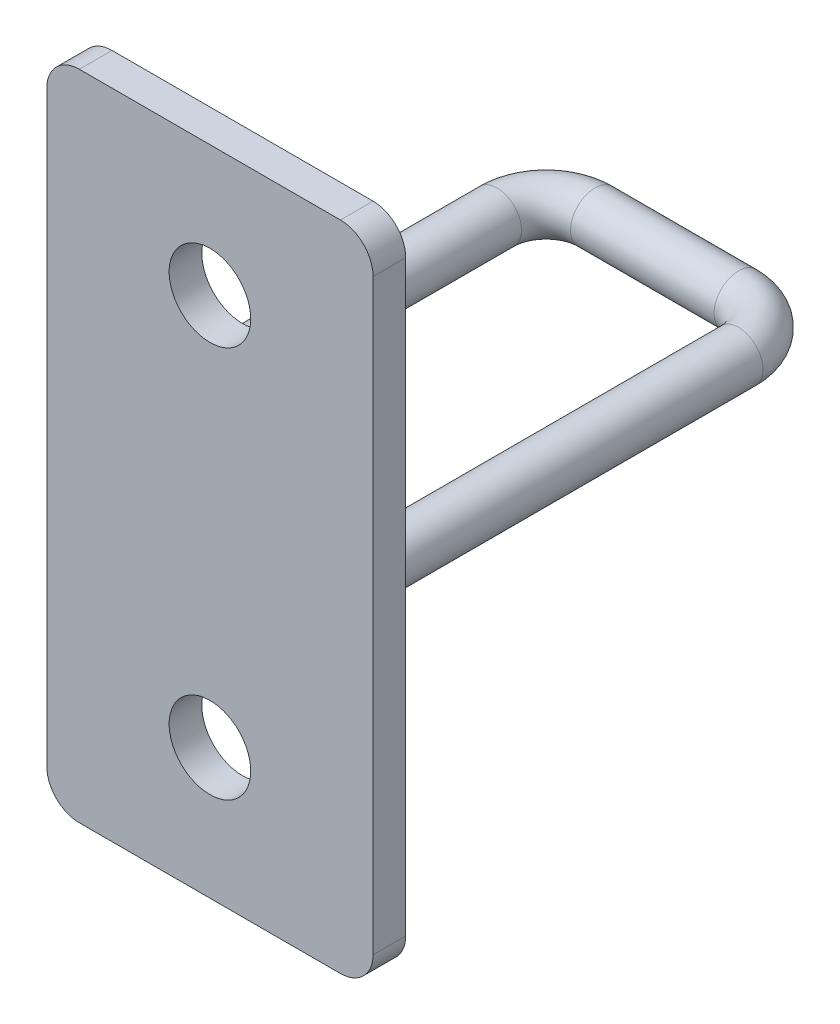
ISO-10303-21;
HEADER;
FILE_DESCRIPTION(('STEP AP214'),'2;1');
FILE_NAME('part.step','',(''),(''),'','','');
FILE_SCHEMA(('AUTOMOTIVE_DESIGN { 1 0 10303 214 1 1 1 1 }'));
ENDSEC;
DATA;
#1=APPLICATION_CONTEXT('core data for automotive mechanical design processes');
#2=APPLICATION_PROTOCOL_DEFINITION('international standard','automotive_design',2000,#1);
#3=PRODUCT_CONTEXT('',#1,'mechanical');
#4=PRODUCT('Part','Part','',(#3));
#5=PRODUCT_RELATED_PRODUCT_CATEGORY('part','',(#4));
#6=PRODUCT_DEFINITION_FORMATION('','',#4);
#7=PRODUCT_DEFINITION_CONTEXT('part definition',#1,'design');
#8=PRODUCT_DEFINITION('design','',#6,#7);
#9=PRODUCT_DEFINITION_SHAPE('','',#8);
#10=(LENGTH_UNIT() NAMED_UNIT(*) SI_UNIT(.MILLI.,.METRE.));
#11=(NAMED_UNIT(*) PLANE_ANGLE_UNIT() SI_UNIT($,.RADIAN.));
#12=(NAMED_UNIT(*) SI_UNIT($,.STERADIAN.) SOLID_ANGLE_UNIT());
#13=UNCERTAINTY_MEASURE_WITH_UNIT(LENGTH_MEASURE(1.E-05),#10,'distance_accuracy_value','');
#14=(GEOMETRIC_REPRESENTATION_CONTEXT(3) GLOBAL_UNCERTAINTY_ASSIGNED_CONTEXT((#13)) GLOBAL_UNIT_ASSIGNED_CONTEXT((#10,
#11,#12)) REPRESENTATION_CONTEXT('',''));
#15=CARTESIAN_POINT('',(0.,0.,0.));
#16=DIRECTION('',(0.,0.,1.));
#17=DIRECTION('',(1.,0.,0.));
#18=AXIS2_PLACEMENT_3D('',#15,#16,#17);
#19=CARTESIAN_POINT('',(0.,0.,0.));
#20=DIRECTION('',(0.,0.,1.));
#21=DIRECTION('',(1.,0.,0.));
#22=AXIS2_PLACEMENT_3D('',#19,#20,#21);
#23=PLANE('',#22);
#24=CARTESIAN_POINT('',(5.,-16.,0.));
#25=DIRECTION('',(0.,0.,1.));
#26=DIRECTION('',(1.,0.,0.));
#27=AXIS2_PLACEMENT_3D('',#24,#25,#26);
#28=CIRCLE('',#27,1.25);
#29=CARTESIAN_POINT('',(6.25,-16.,0.));
#30=VERTEX_POINT('',#29);
#31=EDGE_CURVE('E197',#30,#30,#28,.T.);
#32=ORIENTED_EDGE('',*,*,#31,.T.);
#33=EDGE_LOOP('',(#32));
#34=FACE_BOUND('',#33,.T.);
#35=CARTESIAN_POINT('',(5.,-4.,0.));
#36=DIRECTION('',(0.,0.,1.));
#37=DIRECTION('',(1.,0.,0.));
#38=AXIS2_PLACEMENT_3D('',#35,#36,#37);
#39=CIRCLE('',#38,1.25);
#40=CARTESIAN_POINT('',(6.25,-4.,0.));
#41=VERTEX_POINT('',#40);
#42=EDGE_CURVE('E186',#41,#41,#39,.T.);
#43=ORIENTED_EDGE('',*,*,#42,.T.);
#44=EDGE_LOOP('',(#43));
#45=FACE_BOUND('',#44,.T.);
#46=DIRECTION('',(0.,1.,0.));
#47=VECTOR('',#46,1.);
#48=CARTESIAN_POINT('',(10.,0.,0.));
#49=LINE('',#48,#47);
#50=CARTESIAN_POINT('',(10.,-19.,0.));
#51=VERTEX_POINT('',#50);
#52=CARTESIAN_POINT('',(10.,-1.,0.));
#53=VERTEX_POINT('',#52);
#54=EDGE_CURVE('E127',#51,#53,#49,.T.);
#55=ORIENTED_EDGE('',*,*,#54,.F.);
#56=CARTESIAN_POINT('',(9.,-19.,0.));
#57=DIRECTION('',(0.,0.,1.));
#58=DIRECTION('',(1.,0.,0.));
#59=AXIS2_PLACEMENT_3D('',#56,#57,#58);
#60=CIRCLE('',#59,1.);
#61=CARTESIAN_POINT('',(9.,-20.,0.));
#62=VERTEX_POINT('',#61);
#63=EDGE_CURVE('E110',#51,#62,#60,.F.);
#64=ORIENTED_EDGE('',*,*,#63,.T.);
#65=DIRECTION('',(1.,0.,0.));
#66=VECTOR('',#65,1.);
#67=CARTESIAN_POINT('',(0.,-20.,0.));
#68=LINE('',#67,#66);
#69=CARTESIAN_POINT('',(1.,-20.,0.));
#70=VERTEX_POINT('',#69);
#71=EDGE_CURVE('E136',#70,#62,#68,.T.);
#72=ORIENTED_EDGE('',*,*,#71,.F.);
#73=CARTESIAN_POINT('',(1.,-19.,0.));
#74=DIRECTION('',(0.,0.,1.));
#75=DIRECTION('',(1.,0.,0.));
#76=AXIS2_PLACEMENT_3D('',#73,#74,#75);
#77=CIRCLE('',#76,1.);
#78=CARTESIAN_POINT('',(0.,-19.,0.));
#79=VERTEX_POINT('',#78);
#80=EDGE_CURVE('E121',#70,#79,#77,.F.);
#81=ORIENTED_EDGE('',*,*,#80,.T.);
#82=DIRECTION('',(0.,-1.,0.));
#83=VECTOR('',#82,1.);
#84=CARTESIAN_POINT('',(0.,0.,0.));
#85=LINE('',#84,#83);
#86=CARTESIAN_POINT('',(0.,-1.,0.));
#87=VERTEX_POINT('',#86);
#88=EDGE_CURVE('E140',#87,#79,#85,.T.);
#89=ORIENTED_EDGE('',*,*,#88,.F.);
#90=CARTESIAN_POINT('',(1.,-1.,0.));
#91=DIRECTION('',(0.,0.,1.));
#92=DIRECTION('',(1.,0.,0.));
#93=AXIS2_PLACEMENT_3D('',#90,#91,#92);
#94=CIRCLE('',#93,1.);
#95=CARTESIAN_POINT('',(1.,0.,0.));
#96=VERTEX_POINT('',#95);
#97=EDGE_CURVE('E147',#87,#96,#94,.F.);
#98=ORIENTED_EDGE('',*,*,#97,.T.);
#99=DIRECTION('',(-1.,0.,0.));
#100=VECTOR('',#99,1.);
#101=CARTESIAN_POINT('',(0.,0.,0.));
#102=LINE('',#101,#100);
#103=CARTESIAN_POINT('',(9.,0.,0.));
#104=VERTEX_POINT('',#103);
#105=EDGE_CURVE('E135',#104,#96,#102,.T.);
#106=ORIENTED_EDGE('',*,*,#105,.F.);
#107=CARTESIAN_POINT('',(9.,-1.,0.));
#108=DIRECTION('',(0.,0.,1.));
#109=DIRECTION('',(1.,0.,0.));
#110=AXIS2_PLACEMENT_3D('',#107,#108,#109);
#111=CIRCLE('',#110,1.);
#112=EDGE_CURVE('E130',#104,#53,#111,.F.);
#113=ORIENTED_EDGE('',*,*,#112,.T.);
#114=EDGE_LOOP('',(#55,#64,#72,#81,#89,#98,#106,#113));
#115=FACE_BOUND('',#114,.T.);
#116=CARTESIAN_POINT('',(8.7,-10.,0.));
#117=DIRECTION('',(0.,0.,-1.));
#118=DIRECTION('',(-1.,0.,0.));
#119=AXIS2_PLACEMENT_3D('',#116,#117,#118);
#120=CIRCLE('',#119,0.75);
#121=CARTESIAN_POINT('',(7.95,-10.,0.));
#122=VERTEX_POINT('',#121);
#123=EDGE_CURVE('E11',#122,#122,#120,.T.);
#124=ORIENTED_EDGE('',*,*,#123,.F.);
#125=EDGE_LOOP('',(#124));
#126=FACE_BOUND('',#125,.T.);
#127=CARTESIAN_POINT('',(1.3,-10.,0.));
#128=DIRECTION('',(0.,0.,1.));
#129=DIRECTION('',(1.,0.,0.));
#130=AXIS2_PLACEMENT_3D('',#127,#128,#129);
#131=CIRCLE('',#130,0.75);
#132=CARTESIAN_POINT('',(2.05,-10.,0.));
#133=VERTEX_POINT('',#132);
#134=EDGE_CURVE('E200',#133,#133,#131,.T.);
#135=ORIENTED_EDGE('',*,*,#134,.T.);
#136=EDGE_LOOP('',(#135));
#137=FACE_BOUND('',#136,.T.);
#138=ADVANCED_FACE('F43',(#34,#45,#115,#126,#137),#23,.F.);
#139=CARTESIAN_POINT('',(0.,0.,1.));
#140=DIRECTION('',(0.,0.,1.));
#141=DIRECTION('',(1.,0.,0.));
#142=AXIS2_PLACEMENT_3D('',#139,#140,#141);
#143=PLANE('',#142);
#144=CARTESIAN_POINT('',(5.,-4.,1.));
#145=DIRECTION('',(0.,0.,1.));
#146=DIRECTION('',(1.,0.,0.));
#147=AXIS2_PLACEMENT_3D('',#144,#145,#146);
#148=CIRCLE('',#147,1.25);
#149=CARTESIAN_POINT('',(6.25,-4.,1.));
#150=VERTEX_POINT('',#149);
#151=EDGE_CURVE('E190',#150,#150,#148,.T.);
#152=ORIENTED_EDGE('',*,*,#151,.F.);
#153=EDGE_LOOP('',(#152));
#154=FACE_BOUND('',#153,.T.);
#155=DIRECTION('',(1.,0.,0.));
#156=VECTOR('',#155,1.);
#157=CARTESIAN_POINT('',(0.,-20.,1.));
#158=LINE('',#157,#156);
#159=CARTESIAN_POINT('',(1.,-20.,1.));
#160=VERTEX_POINT('',#159);
#161=CARTESIAN_POINT('',(9.,-20.,1.));
#162=VERTEX_POINT('',#161);
#163=EDGE_CURVE('E181',#160,#162,#158,.T.);
#164=ORIENTED_EDGE('',*,*,#163,.T.);
#165=CARTESIAN_POINT('',(9.,-19.,1.));
#166=DIRECTION('',(0.,0.,1.));
#167=DIRECTION('',(1.,0.,0.));
#168=AXIS2_PLACEMENT_3D('',#165,#166,#167);
#169=CIRCLE('',#168,1.);
#170=CARTESIAN_POINT('',(10.,-19.,1.));
#171=VERTEX_POINT('',#170);
#172=EDGE_CURVE('E158',#162,#171,#169,.T.);
#173=ORIENTED_EDGE('',*,*,#172,.T.);
#174=DIRECTION('',(0.,1.,0.));
#175=VECTOR('',#174,1.);
#176=CARTESIAN_POINT('',(10.,0.,1.));
#177=LINE('',#176,#175);
#178=CARTESIAN_POINT('',(10.,-1.,1.));
#179=VERTEX_POINT('',#178);
#180=EDGE_CURVE('E129',#171,#179,#177,.T.);
#181=ORIENTED_EDGE('',*,*,#180,.T.);
#182=CARTESIAN_POINT('',(9.,-1.,1.));
#183=DIRECTION('',(0.,0.,1.));
#184=DIRECTION('',(1.,0.,0.));
#185=AXIS2_PLACEMENT_3D('',#182,#183,#184);
#186=CIRCLE('',#185,1.);
#187=CARTESIAN_POINT('',(9.,0.,1.));
#188=VERTEX_POINT('',#187);
#189=EDGE_CURVE('E65',#179,#188,#186,.T.);
#190=ORIENTED_EDGE('',*,*,#189,.T.);
#191=DIRECTION('',(-1.,0.,0.));
#192=VECTOR('',#191,1.);
#193=CARTESIAN_POINT('',(0.,0.,1.));
#194=LINE('',#193,#192);
#195=CARTESIAN_POINT('',(1.,0.,1.));
#196=VERTEX_POINT('',#195);
#197=EDGE_CURVE('E144',#188,#196,#194,.T.);
#198=ORIENTED_EDGE('',*,*,#197,.T.);
#199=CARTESIAN_POINT('',(1.,-1.,1.));
#200=DIRECTION('',(0.,0.,1.));
#201=DIRECTION('',(1.,0.,0.));
#202=AXIS2_PLACEMENT_3D('',#199,#200,#201);
#203=CIRCLE('',#202,1.);
#204=CARTESIAN_POINT('',(0.,-1.,1.));
#205=VERTEX_POINT('',#204);
#206=EDGE_CURVE('E154',#196,#205,#203,.T.);
#207=ORIENTED_EDGE('',*,*,#206,.T.);
#208=DIRECTION('',(0.,-1.,0.));
#209=VECTOR('',#208,1.);
#210=CARTESIAN_POINT('',(0.,0.,1.));
#211=LINE('',#210,#209);
#212=CARTESIAN_POINT('',(0.,-19.,1.));
#213=VERTEX_POINT('',#212);
#214=EDGE_CURVE('E138',#205,#213,#211,.T.);
#215=ORIENTED_EDGE('',*,*,#214,.T.);
#216=CARTESIAN_POINT('',(1.,-19.,1.));
#217=DIRECTION('',(0.,0.,1.));
#218=DIRECTION('',(1.,0.,0.));
#219=AXIS2_PLACEMENT_3D('',#216,#217,#218);
#220=CIRCLE('',#219,1.);
#221=EDGE_CURVE('E156',#213,#160,#220,.T.);
#222=ORIENTED_EDGE('',*,*,#221,.T.);
#223=EDGE_LOOP('',(#164,#173,#181,#190,#198,#207,#215,#222));
#224=FACE_BOUND('',#223,.T.);
#225=CARTESIAN_POINT('',(5.,-16.,1.));
#226=DIRECTION('',(0.,0.,1.));
#227=DIRECTION('',(1.,0.,0.));
#228=AXIS2_PLACEMENT_3D('',#225,#226,#227);
#229=CIRCLE('',#228,1.25);
#230=CARTESIAN_POINT('',(6.25,-16.,1.));
#231=VERTEX_POINT('',#230);
#232=EDGE_CURVE('E195',#231,#231,#229,.T.);
#233=ORIENTED_EDGE('',*,*,#232,.F.);
#234=EDGE_LOOP('',(#233));
#235=FACE_BOUND('',#234,.T.);
#236=ADVANCED_FACE('F227',(#154,#224,#235),#143,.T.);
#237=CARTESIAN_POINT('',(0.,0.,1.));
#238=DIRECTION('',(1.,0.,0.));
#239=DIRECTION('',(0.,1.,0.));
#240=AXIS2_PLACEMENT_3D('',#237,#238,#239);
#241=PLANE('',#240);
#242=ORIENTED_EDGE('',*,*,#88,.T.);
#243=DIRECTION('',(0.,0.,-1.));
#244=VECTOR('',#243,1.);
#245=CARTESIAN_POINT('',(0.,-19.,1.));
#246=LINE('',#245,#244);
#247=EDGE_CURVE('E163',#79,#213,#246,.F.);
#248=ORIENTED_EDGE('',*,*,#247,.T.);
#249=ORIENTED_EDGE('',*,*,#214,.F.);
#250=DIRECTION('',(0.,0.,-1.));
#251=VECTOR('',#250,1.);
#252=CARTESIAN_POINT('',(0.,-1.,1.));
#253=LINE('',#252,#251);
#254=EDGE_CURVE('E160',#205,#87,#253,.T.);
#255=ORIENTED_EDGE('',*,*,#254,.T.);
#256=EDGE_LOOP('',(#242,#248,#249,#255));
#257=FACE_BOUND('',#256,.T.);
#258=ADVANCED_FACE('F177',(#257),#241,.F.);
#259=CARTESIAN_POINT('',(0.,-20.,1.));
#260=DIRECTION('',(0.,1.,0.));
#261=DIRECTION('',(0.,0.,1.));
#262=AXIS2_PLACEMENT_3D('',#259,#260,#261);
#263=PLANE('',#262);
#264=ORIENTED_EDGE('',*,*,#71,.T.);
#265=DIRECTION('',(0.,0.,-1.));
#266=VECTOR('',#265,1.);
#267=CARTESIAN_POINT('',(9.,-20.,1.));
#268=LINE('',#267,#266);
#269=EDGE_CURVE('E115',#62,#162,#268,.F.);
#270=ORIENTED_EDGE('',*,*,#269,.T.);
#271=ORIENTED_EDGE('',*,*,#163,.F.);
#272=DIRECTION('',(0.,0.,-1.));
#273=VECTOR('',#272,1.);
#274=CARTESIAN_POINT('',(1.,-20.,1.));
#275=LINE('',#274,#273);
#276=EDGE_CURVE('E120',#160,#70,#275,.T.);
#277=ORIENTED_EDGE('',*,*,#276,.T.);
#278=EDGE_LOOP('',(#264,#270,#271,#277));
#279=FACE_BOUND('',#278,.T.);
#280=ADVANCED_FACE('F269',(#279),#263,.F.);
#281=CARTESIAN_POINT('',(10.,0.,1.));
#282=DIRECTION('',(-1.,0.,0.));
#283=DIRECTION('',(0.,0.,1.));
#284=AXIS2_PLACEMENT_3D('',#281,#282,#283);
#285=PLANE('',#284);
#286=ORIENTED_EDGE('',*,*,#180,.F.);
#287=DIRECTION('',(0.,0.,-1.));
#288=VECTOR('',#287,1.);
#289=CARTESIAN_POINT('',(10.,-19.,1.));
#290=LINE('',#289,#288);
#291=EDGE_CURVE('E114',#171,#51,#290,.T.);
#292=ORIENTED_EDGE('',*,*,#291,.T.);
#293=ORIENTED_EDGE('',*,*,#54,.T.);
#294=DIRECTION('',(0.,0.,-1.));
#295=VECTOR('',#294,1.);
#296=CARTESIAN_POINT('',(10.,-1.,1.));
#297=LINE('',#296,#295);
#298=EDGE_CURVE('E131',#53,#179,#297,.F.);
#299=ORIENTED_EDGE('',*,*,#298,.T.);
#300=EDGE_LOOP('',(#286,#292,#293,#299));
#301=FACE_BOUND('',#300,.T.);
#302=ADVANCED_FACE('F126',(#301),#285,.F.);
#303=CARTESIAN_POINT('',(0.,0.,1.));
#304=DIRECTION('',(0.,-1.,0.));
#305=DIRECTION('',(0.,0.,-1.));
#306=AXIS2_PLACEMENT_3D('',#303,#304,#305);
#307=PLANE('',#306);
#308=ORIENTED_EDGE('',*,*,#105,.T.);
#309=DIRECTION('',(0.,0.,-1.));
#310=VECTOR('',#309,1.);
#311=CARTESIAN_POINT('',(1.,0.,1.));
#312=LINE('',#311,#310);
#313=EDGE_CURVE('E47',#96,#196,#312,.F.);
#314=ORIENTED_EDGE('',*,*,#313,.T.);
#315=ORIENTED_EDGE('',*,*,#197,.F.);
#316=DIRECTION('',(0.,0.,-1.));
#317=VECTOR('',#316,1.);
#318=CARTESIAN_POINT('',(9.,0.,1.));
#319=LINE('',#318,#317);
#320=EDGE_CURVE('E164',#188,#104,#319,.T.);
#321=ORIENTED_EDGE('',*,*,#320,.T.);
#322=EDGE_LOOP('',(#308,#314,#315,#321));
#323=FACE_BOUND('',#322,.T.);
#324=ADVANCED_FACE('F167',(#323),#307,.F.);
#325=CARTESIAN_POINT('',(5.,-4.,1.));
#326=DIRECTION('',(0.,0.,-1.));
#327=DIRECTION('',(-1.,0.,0.));
#328=AXIS2_PLACEMENT_3D('',#325,#326,#327);
#329=CYLINDRICAL_SURFACE('',#328,1.25);
#330=ORIENTED_EDGE('',*,*,#151,.T.);
#331=EDGE_LOOP('',(#330));
#332=FACE_BOUND('',#331,.T.);
#333=ORIENTED_EDGE('',*,*,#42,.F.);
#334=EDGE_LOOP('',(#333));
#335=FACE_BOUND('',#334,.T.);
#336=ADVANCED_FACE('F258',(#332,#335),#329,.F.);
#337=CARTESIAN_POINT('',(5.,-16.,1.));
#338=DIRECTION('',(0.,0.,-1.));
#339=DIRECTION('',(-1.,0.,0.));
#340=AXIS2_PLACEMENT_3D('',#337,#338,#339);
#341=CYLINDRICAL_SURFACE('',#340,1.25);
#342=ORIENTED_EDGE('',*,*,#232,.T.);
#343=EDGE_LOOP('',(#342));
#344=FACE_BOUND('',#343,.T.);
#345=ORIENTED_EDGE('',*,*,#31,.F.);
#346=EDGE_LOOP('',(#345));
#347=FACE_BOUND('',#346,.T.);
#348=ADVANCED_FACE('F255',(#344,#347),#341,.F.);
#349=CARTESIAN_POINT('',(9.,-19.,1.));
#350=DIRECTION('',(0.,0.,-1.));
#351=DIRECTION('',(-1.,0.,0.));
#352=AXIS2_PLACEMENT_3D('',#349,#350,#351);
#353=CYLINDRICAL_SURFACE('',#352,1.);
#354=ORIENTED_EDGE('',*,*,#172,.F.);
#355=ORIENTED_EDGE('',*,*,#269,.F.);
#356=ORIENTED_EDGE('',*,*,#63,.F.);
#357=ORIENTED_EDGE('',*,*,#291,.F.);
#358=EDGE_LOOP('',(#354,#355,#356,#357));
#359=FACE_BOUND('',#358,.T.);
#360=ADVANCED_FACE('F113',(#359),#353,.T.);
#361=CARTESIAN_POINT('',(1.,-19.,1.));
#362=DIRECTION('',(0.,0.,-1.));
#363=DIRECTION('',(-1.,0.,0.));
#364=AXIS2_PLACEMENT_3D('',#361,#362,#363);
#365=CYLINDRICAL_SURFACE('',#364,1.);
#366=ORIENTED_EDGE('',*,*,#221,.F.);
#367=ORIENTED_EDGE('',*,*,#247,.F.);
#368=ORIENTED_EDGE('',*,*,#80,.F.);
#369=ORIENTED_EDGE('',*,*,#276,.F.);
#370=EDGE_LOOP('',(#366,#367,#368,#369));
#371=FACE_BOUND('',#370,.T.);
#372=ADVANCED_FACE('F277',(#371),#365,.T.);
#373=CARTESIAN_POINT('',(1.,-1.,1.));
#374=DIRECTION('',(0.,0.,-1.));
#375=DIRECTION('',(-1.,0.,0.));
#376=AXIS2_PLACEMENT_3D('',#373,#374,#375);
#377=CYLINDRICAL_SURFACE('',#376,1.);
#378=ORIENTED_EDGE('',*,*,#206,.F.);
#379=ORIENTED_EDGE('',*,*,#313,.F.);
#380=ORIENTED_EDGE('',*,*,#97,.F.);
#381=ORIENTED_EDGE('',*,*,#254,.F.);
#382=EDGE_LOOP('',(#378,#379,#380,#381));
#383=FACE_BOUND('',#382,.T.);
#384=ADVANCED_FACE('F174',(#383),#377,.T.);
#385=CARTESIAN_POINT('',(9.,-1.,1.));
#386=DIRECTION('',(0.,0.,-1.));
#387=DIRECTION('',(-1.,0.,0.));
#388=AXIS2_PLACEMENT_3D('',#385,#386,#387);
#389=CYLINDRICAL_SURFACE('',#388,1.);
#390=ORIENTED_EDGE('',*,*,#189,.F.);
#391=ORIENTED_EDGE('',*,*,#298,.F.);
#392=ORIENTED_EDGE('',*,*,#112,.F.);
#393=ORIENTED_EDGE('',*,*,#320,.F.);
#394=EDGE_LOOP('',(#390,#391,#392,#393));
#395=FACE_BOUND('',#394,.T.);
#396=ADVANCED_FACE('F45',(#395),#389,.T.);
#397=CARTESIAN_POINT('',(8.7,-10.,0.));
#398=DIRECTION('',(0.,0.,-1.));
#399=DIRECTION('',(-1.,0.,0.));
#400=AXIS2_PLACEMENT_3D('',#397,#398,#399);
#401=CYLINDRICAL_SURFACE('',#400,0.75);
#402=CARTESIAN_POINT('',(8.7,-10.,-11.5));
#403=DIRECTION('',(0.,0.,-1.));
#404=DIRECTION('',(-1.,0.,0.));
#405=AXIS2_PLACEMENT_3D('',#402,#403,#404);
#406=CIRCLE('',#405,0.75);
#407=CARTESIAN_POINT('',(9.45,-10.,-11.5));
#408=VERTEX_POINT('',#407);
#409=EDGE_CURVE('E214',#408,#408,#406,.T.);
#410=ORIENTED_EDGE('',*,*,#409,.F.);
#411=EDGE_LOOP('',(#410));
#412=FACE_BOUND('',#411,.T.);
#413=ORIENTED_EDGE('',*,*,#123,.T.);
#414=EDGE_LOOP('',(#413));
#415=FACE_BOUND('',#414,.T.);
#416=ADVANCED_FACE('F220',(#412,#415),#401,.T.);
#417=CARTESIAN_POINT('',(7.2,-10.,-11.5));
#418=DIRECTION('',(0.,1.,0.));
#419=DIRECTION('',(0.,0.,1.));
#420=AXIS2_PLACEMENT_3D('',#417,#418,#419);
#421=TOROIDAL_SURFACE('',#420,1.5,0.75);
#422=CARTESIAN_POINT('',(7.2,-10.,-13.));
#423=DIRECTION('',(-1.,0.,0.));
#424=DIRECTION('',(0.,0.,1.));
#425=AXIS2_PLACEMENT_3D('',#422,#423,#424);
#426=CIRCLE('',#425,0.75);
#427=CARTESIAN_POINT('',(7.2,-10.,-13.75));
#428=VERTEX_POINT('',#427);
#429=EDGE_CURVE('E211',#428,#428,#426,.T.);
#430=CARTESIAN_POINT('',(7.2,-10.,-11.5));
#431=DIRECTION('',(0.,1.,0.));
#432=DIRECTION('',(0.,0.,1.));
#433=AXIS2_PLACEMENT_3D('',#430,#431,#432);
#434=CIRCLE('',#433,2.25);
#435=EDGE_CURVE('',#408,#428,#434,.T.);
#436=ORIENTED_EDGE('',*,*,#409,.T.);
#437=ORIENTED_EDGE('',*,*,#429,.F.);
#438=ORIENTED_EDGE('',*,*,#435,.T.);
#439=ORIENTED_EDGE('',*,*,#435,.F.);
#440=EDGE_LOOP('',(#436,#438,#437,#439));
#441=FACE_BOUND('',#440,.T.);
#442=ADVANCED_FACE('F218',(#441),#421,.T.);
#443=CARTESIAN_POINT('',(7.2,-10.,-13.));
#444=DIRECTION('',(-1.,0.,0.));
#445=DIRECTION('',(0.,0.,1.));
#446=AXIS2_PLACEMENT_3D('',#443,#444,#445);
#447=CYLINDRICAL_SURFACE('',#446,0.75);
#448=CARTESIAN_POINT('',(2.8,-10.,-13.));
#449=DIRECTION('',(-1.,0.,0.));
#450=DIRECTION('',(0.,0.,1.));
#451=AXIS2_PLACEMENT_3D('',#448,#449,#450);
#452=CIRCLE('',#451,0.75);
#453=CARTESIAN_POINT('',(2.8,-10.,-13.75));
#454=VERTEX_POINT('',#453);
#455=EDGE_CURVE('E208',#454,#454,#452,.T.);
#456=ORIENTED_EDGE('',*,*,#455,.F.);
#457=EDGE_LOOP('',(#456));
#458=FACE_BOUND('',#457,.T.);
#459=ORIENTED_EDGE('',*,*,#429,.T.);
#460=EDGE_LOOP('',(#459));
#461=FACE_BOUND('',#460,.T.);
#462=ADVANCED_FACE('F241',(#458,#461),#447,.T.);
#463=CARTESIAN_POINT('',(2.8,-10.,-11.5));
#464=DIRECTION('',(0.,1.,0.));
#465=DIRECTION('',(0.,0.,1.));
#466=AXIS2_PLACEMENT_3D('',#463,#464,#465);
#467=TOROIDAL_SURFACE('',#466,1.5,0.75);
#468=CARTESIAN_POINT('',(1.3,-10.,-11.5));
#469=DIRECTION('',(0.,0.,1.));
#470=DIRECTION('',(1.,0.,0.));
#471=AXIS2_PLACEMENT_3D('',#468,#469,#470);
#472=CIRCLE('',#471,0.75);
#473=CARTESIAN_POINT('',(0.550000000000002,-10.,-11.5));
#474=VERTEX_POINT('',#473);
#475=EDGE_CURVE('E205',#474,#474,#472,.T.);
#476=CARTESIAN_POINT('',(2.8,-10.,-11.5));
#477=DIRECTION('',(0.,1.,0.));
#478=DIRECTION('',(0.,0.,1.));
#479=AXIS2_PLACEMENT_3D('',#476,#477,#478);
#480=CIRCLE('',#479,2.25);
#481=EDGE_CURVE('',#454,#474,#480,.T.);
#482=ORIENTED_EDGE('',*,*,#455,.T.);
#483=ORIENTED_EDGE('',*,*,#475,.F.);
#484=ORIENTED_EDGE('',*,*,#481,.T.);
#485=ORIENTED_EDGE('',*,*,#481,.F.);
#486=EDGE_LOOP('',(#482,#484,#483,#485));
#487=FACE_BOUND('',#486,.T.);
#488=ADVANCED_FACE('F235',(#487),#467,.T.);
#489=CARTESIAN_POINT('',(1.3,-10.,-11.5));
#490=DIRECTION('',(0.,0.,1.));
#491=DIRECTION('',(1.,0.,0.));
#492=AXIS2_PLACEMENT_3D('',#489,#490,#491);
#493=CYLINDRICAL_SURFACE('',#492,0.75);
#494=ORIENTED_EDGE('',*,*,#134,.F.);
#495=EDGE_LOOP('',(#494));
#496=FACE_BOUND('',#495,.T.);
#497=ORIENTED_EDGE('',*,*,#475,.T.);
#498=EDGE_LOOP('',(#497));
#499=FACE_BOUND('',#498,.T.);
#500=ADVANCED_FACE('F232',(#496,#499),#493,.T.);
#501=CLOSED_SHELL('',(#138,#236,#258,#280,#302,#324,#336,#348,#360,#372,#384,#396,#416,#442,
#462,#488,#500));
#502=MANIFOLD_SOLID_BREP('B2',#501);
#503=ADVANCED_BREP_SHAPE_REPRESENTATION('',(#18,#502),#14);
#504=SHAPE_DEFINITION_REPRESENTATION(#9,#503);
ENDSEC;
END-ISO-10303-21;
